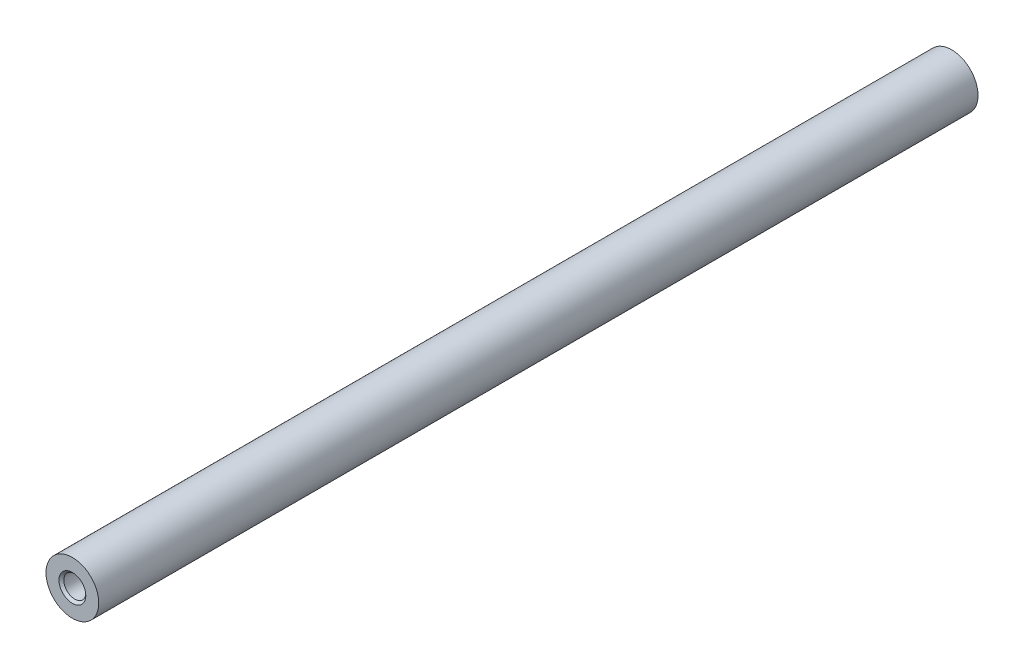
ISO-10303-21;
HEADER;
FILE_DESCRIPTION(('STEP AP214'),'2;1');
FILE_NAME('part.step','',(''),(''),'','','');
FILE_SCHEMA(('AUTOMOTIVE_DESIGN { 1 0 10303 214 1 1 1 1 }'));
ENDSEC;
DATA;
#1=APPLICATION_CONTEXT('core data for automotive mechanical design processes');
#2=APPLICATION_PROTOCOL_DEFINITION('international standard','automotive_design',2000,#1);
#3=PRODUCT_CONTEXT('',#1,'mechanical');
#4=PRODUCT('Part','Part','',(#3));
#5=PRODUCT_RELATED_PRODUCT_CATEGORY('part','',(#4));
#6=PRODUCT_DEFINITION_FORMATION('','',#4);
#7=PRODUCT_DEFINITION_CONTEXT('part definition',#1,'design');
#8=PRODUCT_DEFINITION('design','',#6,#7);
#9=PRODUCT_DEFINITION_SHAPE('','',#8);
#10=(LENGTH_UNIT() NAMED_UNIT(*) SI_UNIT(.MILLI.,.METRE.));
#11=(NAMED_UNIT(*) PLANE_ANGLE_UNIT() SI_UNIT($,.RADIAN.));
#12=(NAMED_UNIT(*) SI_UNIT($,.STERADIAN.) SOLID_ANGLE_UNIT());
#13=UNCERTAINTY_MEASURE_WITH_UNIT(LENGTH_MEASURE(1.E-05),#10,'distance_accuracy_value','');
#14=(GEOMETRIC_REPRESENTATION_CONTEXT(3) GLOBAL_UNCERTAINTY_ASSIGNED_CONTEXT((#13)) GLOBAL_UNIT_ASSIGNED_CONTEXT((#10,
#11,#12)) REPRESENTATION_CONTEXT('',''));
#15=CARTESIAN_POINT('',(0.,0.,0.));
#16=DIRECTION('',(0.,0.,1.));
#17=DIRECTION('',(1.,0.,0.));
#18=AXIS2_PLACEMENT_3D('',#15,#16,#17);
#19=CARTESIAN_POINT('',(0.,0.,100.));
#20=DIRECTION('',(0.,0.,-1.));
#21=DIRECTION('',(-1.,0.,0.));
#22=AXIS2_PLACEMENT_3D('',#19,#20,#21);
#23=CYLINDRICAL_SURFACE('',#22,3.);
#24=CARTESIAN_POINT('',(0.,0.,100.));
#25=DIRECTION('',(0.,0.,1.));
#26=DIRECTION('',(1.,0.,0.));
#27=AXIS2_PLACEMENT_3D('',#24,#25,#26);
#28=CIRCLE('',#27,3.);
#29=CARTESIAN_POINT('',(-3.,0.,100.));
#30=VERTEX_POINT('',#29);
#31=EDGE_CURVE('E10',#30,#30,#28,.T.);
#32=CARTESIAN_POINT('',(0.,0.,0.));
#33=DIRECTION('',(0.,0.,1.));
#34=DIRECTION('',(1.,0.,0.));
#35=AXIS2_PLACEMENT_3D('',#32,#33,#34);
#36=CIRCLE('',#35,3.);
#37=CARTESIAN_POINT('',(-3.,0.,0.));
#38=VERTEX_POINT('',#37);
#39=EDGE_CURVE('E37',#38,#38,#36,.T.);
#40=CARTESIAN_POINT('',(-3.,0.,100.));
#41=CARTESIAN_POINT('',(-3.,0.,98.9583333333333));
#42=CARTESIAN_POINT('',(-3.,0.,97.9166666666667));
#43=CARTESIAN_POINT('',(-3.,0.,95.8333333333333));
#44=CARTESIAN_POINT('',(-3.,0.,94.7916666666666));
#45=CARTESIAN_POINT('',(-3.,0.,92.7083333333333));
#46=CARTESIAN_POINT('',(-3.,0.,91.6666666666666));
#47=CARTESIAN_POINT('',(-3.,0.,89.5833333333333));
#48=CARTESIAN_POINT('',(-3.,0.,88.5416666666666));
#49=CARTESIAN_POINT('',(-3.,0.,86.4583333333333));
#50=CARTESIAN_POINT('',(-3.,0.,85.4166666666667));
#51=CARTESIAN_POINT('',(-3.,0.,83.3333333333333));
#52=CARTESIAN_POINT('',(-3.,0.,82.2916666666667));
#53=CARTESIAN_POINT('',(-3.,0.,80.2083333333333));
#54=CARTESIAN_POINT('',(-3.,0.,79.1666666666666));
#55=CARTESIAN_POINT('',(-3.,0.,77.0833333333333));
#56=CARTESIAN_POINT('',(-3.,0.,76.0416666666666));
#57=CARTESIAN_POINT('',(-3.,0.,73.9583333333333));
#58=CARTESIAN_POINT('',(-3.,0.,72.9166666666667));
#59=CARTESIAN_POINT('',(-3.,0.,70.8333333333333));
#60=CARTESIAN_POINT('',(-3.,0.,69.7916666666667));
#61=CARTESIAN_POINT('',(-3.,0.,67.7083333333333));
#62=CARTESIAN_POINT('',(-3.,0.,66.6666666666667));
#63=CARTESIAN_POINT('',(-3.,0.,64.5833333333333));
#64=CARTESIAN_POINT('',(-3.,0.,63.5416666666667));
#65=CARTESIAN_POINT('',(-3.,0.,61.4583333333333));
#66=CARTESIAN_POINT('',(-3.,0.,60.4166666666667));
#67=CARTESIAN_POINT('',(-3.,0.,58.3333333333333));
#68=CARTESIAN_POINT('',(-3.,0.,57.2916666666667));
#69=CARTESIAN_POINT('',(-3.,0.,55.2083333333333));
#70=CARTESIAN_POINT('',(-3.,0.,54.1666666666667));
#71=CARTESIAN_POINT('',(-3.,0.,52.0833333333333));
#72=CARTESIAN_POINT('',(-3.,0.,51.0416666666667));
#73=CARTESIAN_POINT('',(-3.,0.,48.9583333333333));
#74=CARTESIAN_POINT('',(-3.,0.,47.9166666666667));
#75=CARTESIAN_POINT('',(-3.,0.,45.8333333333333));
#76=CARTESIAN_POINT('',(-3.,0.,44.7916666666667));
#77=CARTESIAN_POINT('',(-3.,0.,42.7083333333333));
#78=CARTESIAN_POINT('',(-3.,0.,41.6666666666667));
#79=CARTESIAN_POINT('',(-3.,0.,39.5833333333333));
#80=CARTESIAN_POINT('',(-3.,0.,38.5416666666667));
#81=CARTESIAN_POINT('',(-3.,0.,36.4583333333333));
#82=CARTESIAN_POINT('',(-3.,0.,35.4166666666667));
#83=CARTESIAN_POINT('',(-3.,0.,33.3333333333333));
#84=CARTESIAN_POINT('',(-3.,0.,32.2916666666667));
#85=CARTESIAN_POINT('',(-3.,0.,30.2083333333333));
#86=CARTESIAN_POINT('',(-3.,0.,29.1666666666667));
#87=CARTESIAN_POINT('',(-3.,0.,27.0833333333333));
#88=CARTESIAN_POINT('',(-3.,0.,26.0416666666667));
#89=CARTESIAN_POINT('',(-3.,0.,23.9583333333333));
#90=CARTESIAN_POINT('',(-3.,0.,22.9166666666667));
#91=CARTESIAN_POINT('',(-3.,0.,20.8333333333333));
#92=CARTESIAN_POINT('',(-3.,0.,19.7916666666667));
#93=CARTESIAN_POINT('',(-3.,0.,17.7083333333333));
#94=CARTESIAN_POINT('',(-3.,0.,16.6666666666667));
#95=CARTESIAN_POINT('',(-3.,0.,14.5833333333333));
#96=CARTESIAN_POINT('',(-3.,0.,13.5416666666667));
#97=CARTESIAN_POINT('',(-3.,0.,11.4583333333333));
#98=CARTESIAN_POINT('',(-3.,0.,10.4166666666667));
#99=CARTESIAN_POINT('',(-3.,0.,8.33333333333333));
#100=CARTESIAN_POINT('',(-3.,0.,7.29166666666667));
#101=CARTESIAN_POINT('',(-3.,0.,5.20833333333334));
#102=CARTESIAN_POINT('',(-3.,0.,4.16666666666667));
#103=CARTESIAN_POINT('',(-3.,0.,2.08333333333334));
#104=CARTESIAN_POINT('',(-3.,0.,1.04166666666667));
#105=CARTESIAN_POINT('',(-3.,0.,0.));
#106=B_SPLINE_CURVE_WITH_KNOTS('',3,(#40,#41,#42,#43,#44,#45,#46,#47,#48,#49,#50,#51,#52,#53,
#54,#55,#56,#57,#58,#59,#60,#61,#62,#63,#64,#65,#66,#67,#68,#69,#70,#71,#72,#73,#74,#75,#76,#77,
#78,#79,#80,#81,#82,#83,#84,#85,#86,#87,#88,#89,#90,#91,#92,#93,#94,#95,#96,#97,#98,#99,#100,
#101,#102,#103,#104,#105),.UNSPECIFIED.,.F.,.F.,(4,2,2,2,2,2,2,2,2,2,2,2,2,2,2,2,2,2,2,2,2,2,2,
2,2,2,2,2,2,2,2,2,4),(0.,3.125,6.25000000000001,9.37500000000001,12.5,15.625,18.75,21.875,25.,
28.125,31.25,34.375,37.5,40.625,43.75,46.875,50.,53.125,56.25,59.375,62.5,65.625,68.75,71.875,
75.,78.125,81.25,84.375,87.5,90.625,93.75,96.875,100.),.UNSPECIFIED.);
#107=EDGE_CURVE('BSEAM34',#30,#38,#106,.T.);
#108=ORIENTED_EDGE('',*,*,#31,.F.);
#109=ORIENTED_EDGE('',*,*,#39,.T.);
#110=ORIENTED_EDGE('',*,*,#107,.T.);
#111=ORIENTED_EDGE('',*,*,#107,.F.);
#112=EDGE_LOOP('',(#108,#110,#109,#111));
#113=FACE_BOUND('',#112,.T.);
#114=ADVANCED_FACE('F34',(#113),#23,.T.);
#115=CARTESIAN_POINT('',(0.,0.,100.));
#116=DIRECTION('',(0.,0.,1.));
#117=DIRECTION('',(1.,0.,0.));
#118=AXIS2_PLACEMENT_3D('',#115,#116,#117);
#119=PLANE('',#118);
#120=CARTESIAN_POINT('',(0.,0.,100.));
#121=DIRECTION('',(0.,0.,1.));
#122=DIRECTION('',(1.,0.,0.));
#123=AXIS2_PLACEMENT_3D('',#120,#121,#122);
#124=CIRCLE('',#123,1.525);
#125=CARTESIAN_POINT('',(1.525,0.,100.));
#126=VERTEX_POINT('',#125);
#127=EDGE_CURVE('E51',#126,#126,#124,.T.);
#128=ORIENTED_EDGE('',*,*,#127,.F.);
#129=EDGE_LOOP('',(#128));
#130=FACE_BOUND('',#129,.T.);
#131=ORIENTED_EDGE('',*,*,#31,.T.);
#132=EDGE_LOOP('',(#131));
#133=FACE_BOUND('',#132,.T.);
#134=ADVANCED_FACE('F57',(#130,#133),#119,.T.);
#135=CARTESIAN_POINT('',(0.,0.,0.));
#136=DIRECTION('',(0.,0.,1.));
#137=DIRECTION('',(1.,0.,0.));
#138=AXIS2_PLACEMENT_3D('',#135,#136,#137);
#139=PLANE('',#138);
#140=CARTESIAN_POINT('',(0.,0.,0.));
#141=DIRECTION('',(0.,0.,1.));
#142=DIRECTION('',(1.,0.,0.));
#143=AXIS2_PLACEMENT_3D('',#140,#141,#142);
#144=CIRCLE('',#143,1.24999999999999);
#145=CARTESIAN_POINT('',(1.24999999999999,0.,0.));
#146=VERTEX_POINT('',#145);
#147=EDGE_CURVE('E44',#146,#146,#144,.T.);
#148=ORIENTED_EDGE('',*,*,#147,.T.);
#149=EDGE_LOOP('',(#148));
#150=FACE_BOUND('',#149,.T.);
#151=ORIENTED_EDGE('',*,*,#39,.F.);
#152=EDGE_LOOP('',(#151));
#153=FACE_BOUND('',#152,.T.);
#154=ADVANCED_FACE('F59',(#150,#153),#139,.F.);
#155=CARTESIAN_POINT('',(0.,0.,100.));
#156=DIRECTION('',(0.,0.,1.));
#157=DIRECTION('',(1.,0.,0.));
#158=AXIS2_PLACEMENT_3D('',#155,#156,#157);
#159=CYLINDRICAL_SURFACE('',#158,1.24999999999999);
#160=ORIENTED_EDGE('',*,*,#147,.F.);
#161=EDGE_LOOP('',(#160));
#162=FACE_BOUND('',#161,.T.);
#163=CARTESIAN_POINT('',(0.,0.,99.725));
#164=DIRECTION('',(0.,0.,1.));
#165=DIRECTION('',(1.,0.,0.));
#166=AXIS2_PLACEMENT_3D('',#163,#164,#165);
#167=CIRCLE('',#166,1.25);
#168=CARTESIAN_POINT('',(1.25,0.,99.725));
#169=VERTEX_POINT('',#168);
#170=EDGE_CURVE('E48',#169,#169,#167,.T.);
#171=ORIENTED_EDGE('',*,*,#170,.T.);
#172=EDGE_LOOP('',(#171));
#173=FACE_BOUND('',#172,.T.);
#174=ADVANCED_FACE('F65',(#162,#173),#159,.F.);
#175=CARTESIAN_POINT('',(0.,0.,100.));
#176=DIRECTION('',(0.,0.,1.));
#177=DIRECTION('',(1.,0.,0.));
#178=AXIS2_PLACEMENT_3D('',#175,#176,#177);
#179=CONICAL_SURFACE('',#178,1.525,0.785398163397429);
#180=ORIENTED_EDGE('',*,*,#170,.F.);
#181=EDGE_LOOP('',(#180));
#182=FACE_BOUND('',#181,.T.);
#183=ORIENTED_EDGE('',*,*,#127,.T.);
#184=EDGE_LOOP('',(#183));
#185=FACE_BOUND('',#184,.T.);
#186=ADVANCED_FACE('F55',(#182,#185),#179,.F.);
#187=CLOSED_SHELL('',(#114,#134,#154,#174,#186));
#188=MANIFOLD_SOLID_BREP('B2',#187);
#189=ADVANCED_BREP_SHAPE_REPRESENTATION('',(#18,#188),#14);
#190=SHAPE_DEFINITION_REPRESENTATION(#9,#189);
ENDSEC;
END-ISO-10303-21;
